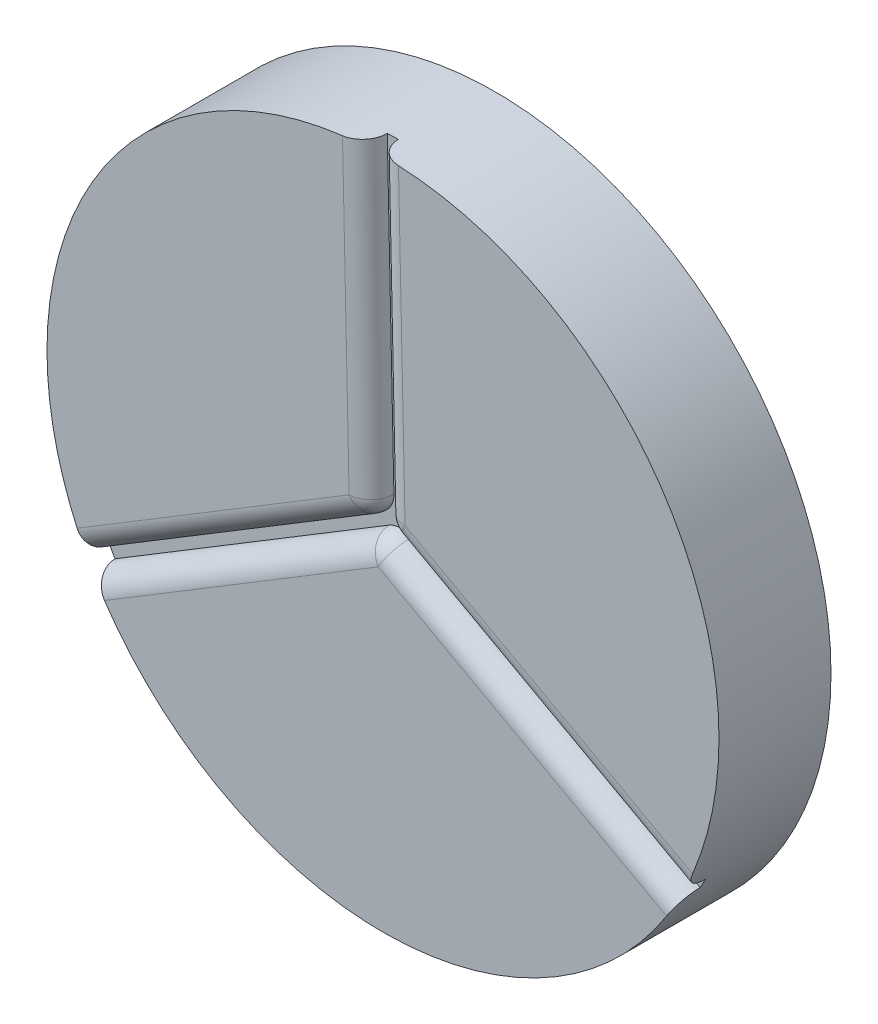
ISO-10303-21;
HEADER;
FILE_DESCRIPTION(('STEP AP214'),'2;1');
FILE_NAME('part.step','',(''),(''),'','','');
FILE_SCHEMA(('AUTOMOTIVE_DESIGN { 1 0 10303 214 1 1 1 1 }'));
ENDSEC;
DATA;
#1=APPLICATION_CONTEXT('core data for automotive mechanical design processes');
#2=APPLICATION_PROTOCOL_DEFINITION('international standard','automotive_design',2000,#1);
#3=PRODUCT_CONTEXT('',#1,'mechanical');
#4=PRODUCT('Part','Part','',(#3));
#5=PRODUCT_RELATED_PRODUCT_CATEGORY('part','',(#4));
#6=PRODUCT_DEFINITION_FORMATION('','',#4);
#7=PRODUCT_DEFINITION_CONTEXT('part definition',#1,'design');
#8=PRODUCT_DEFINITION('design','',#6,#7);
#9=PRODUCT_DEFINITION_SHAPE('','',#8);
#10=(LENGTH_UNIT() NAMED_UNIT(*) SI_UNIT(.MILLI.,.METRE.));
#11=(NAMED_UNIT(*) PLANE_ANGLE_UNIT() SI_UNIT($,.RADIAN.));
#12=(NAMED_UNIT(*) SI_UNIT($,.STERADIAN.) SOLID_ANGLE_UNIT());
#13=UNCERTAINTY_MEASURE_WITH_UNIT(LENGTH_MEASURE(1.E-05),#10,'distance_accuracy_value','');
#14=(GEOMETRIC_REPRESENTATION_CONTEXT(3) GLOBAL_UNCERTAINTY_ASSIGNED_CONTEXT((#13)) GLOBAL_UNIT_ASSIGNED_CONTEXT((#10,
#11,#12)) REPRESENTATION_CONTEXT('',''));
#15=CARTESIAN_POINT('',(0.,0.,0.));
#16=DIRECTION('',(0.,0.,1.));
#17=DIRECTION('',(1.,0.,0.));
#18=AXIS2_PLACEMENT_3D('',#15,#16,#17);
#19=CARTESIAN_POINT('',(0.0986919220805698,0.120916949838367,-0.100000000000118));
#20=DIRECTION('',(-0.740494050701913,-0.449075228525401,0.499999999999931));
#21=DIRECTION('',(-0.518547408150426,0.855048879012467,1.24938948076192E-12));
#22=AXIS2_PLACEMENT_3D('',#19,#20,#21);
#23=SPHERICAL_SURFACE('',#22,0.0999999999997225);
#24=CARTESIAN_POINT('',(0.0986919220811878,0.120916949838977,-0.1));
#25=DIRECTION('',(0.876599668029982,-0.48122034662899,0.));
#26=DIRECTION('',(0.48122034662899,0.876599668029982,0.));
#27=AXIS2_PLACEMENT_3D('',#24,#25,#26);
#28=CIRCLE('',#27,0.1);
#29=CARTESIAN_POINT('',(0.0986919220808351,0.120916949838754,0.));
#30=VERTEX_POINT('',#29);
#31=CARTESIAN_POINT('',(0.0505698874181295,0.0332569830359396,-0.1));
#32=VERTEX_POINT('',#31);
#33=EDGE_CURVE('E196',#30,#32,#28,.T.);
#34=ORIENTED_EDGE('',*,*,#33,.F.);
#35=CARTESIAN_POINT('',(0.098691922080996,0.120916949838389,-0.1));
#36=DIRECTION('',(0.0215507890165299,-0.999767754777461,0.));
#37=DIRECTION('',(0.999767754777461,0.0215507890165299,0.));
#38=AXIS2_PLACEMENT_3D('',#35,#36,#37);
#39=CIRCLE('',#38,0.1);
#40=CARTESIAN_POINT('',(-0.00128485339676502,0.118761870936874,-0.1));
#41=VERTEX_POINT('',#40);
#42=EDGE_CURVE('E211',#41,#30,#39,.F.);
#43=ORIENTED_EDGE('',*,*,#42,.F.);
#44=CARTESIAN_POINT('',(0.0986919220805907,0.120916949838392,-0.1));
#45=DIRECTION('',(0.,0.,-1.));
#46=DIRECTION('',(-1.,0.,0.));
#47=AXIS2_PLACEMENT_3D('',#44,#45,#46);
#48=CIRCLE('',#47,0.0999999999996428);
#49=EDGE_CURVE('E108',#41,#32,#48,.F.);
#50=ORIENTED_EDGE('',*,*,#49,.T.);
#51=EDGE_LOOP('',(#34,#43,#50));
#52=FACE_BOUND('',#51,.T.);
#53=ADVANCED_FACE('F17',(#52),#23,.T.);
#54=CARTESIAN_POINT('',(-0.151250016613774,0.1155292525847,-0.0999999999977621));
#55=DIRECTION('',(0.759157581463048,-0.416749044998445,0.500000000000061));
#56=DIRECTION('',(-0.48122034662878,-0.876599668030098,0.));
#57=AXIS2_PLACEMENT_3D('',#54,#55,#56);
#58=SPHERICAL_SURFACE('',#57,0.0999999999993052);
#59=CARTESIAN_POINT('',(-0.151250016613774,0.1155292525847,-0.1));
#60=DIRECTION('',(0.,0.,-1.));
#61=DIRECTION('',(-1.,0.,0.));
#62=AXIS2_PLACEMENT_3D('',#59,#60,#61);
#63=CIRCLE('',#62,0.0999999999993052);
#64=CARTESIAN_POINT('',(-0.0993952757988851,0.0300243646835175,-0.1));
#65=VERTEX_POINT('',#64);
#66=CARTESIAN_POINT('',(-0.0512732411361387,0.117684331486302,-0.1));
#67=VERTEX_POINT('',#66);
#68=EDGE_CURVE('E197',#65,#67,#63,.F.);
#69=ORIENTED_EDGE('',*,*,#68,.T.);
#70=CARTESIAN_POINT('',(-0.15125001661369,0.115529252584605,-0.1));
#71=DIRECTION('',(-0.0215507890165299,0.999767754777461,0.));
#72=DIRECTION('',(-0.999767754777461,-0.0215507890165299,0.));
#73=AXIS2_PLACEMENT_3D('',#70,#71,#72);
#74=CIRCLE('',#73,0.1);
#75=CARTESIAN_POINT('',(-0.15125001661289,0.115529252584002,0.));
#76=VERTEX_POINT('',#75);
#77=EDGE_CURVE('E114',#76,#67,#74,.T.);
#78=ORIENTED_EDGE('',*,*,#77,.F.);
#79=CARTESIAN_POINT('',(-0.151250016613328,0.115529252584909,-0.1));
#80=DIRECTION('',(0.855048879013511,0.518547408148704,0.));
#81=DIRECTION('',(-0.518547408148704,0.855048879013511,0.));
#82=AXIS2_PLACEMENT_3D('',#79,#80,#81);
#83=CIRCLE('',#82,0.1);
#84=EDGE_CURVE('E173',#65,#76,#83,.F.);
#85=ORIENTED_EDGE('',*,*,#84,.F.);
#86=EDGE_LOOP('',(#69,#78,#85));
#87=FACE_BOUND('',#86,.T.);
#88=ADVANCED_FACE('F266',(#87),#58,.T.);
#89=CARTESIAN_POINT('',(-0.0216131645762324,-0.0982329671689023,-0.0999999999999816));
#90=DIRECTION('',(-0.0186635307598088,0.865824273521791,0.50000000000004));
#91=DIRECTION('',(0.,0.500087104601494,-0.865975108078341));
#92=AXIS2_PLACEMENT_3D('',#89,#90,#91);
#93=SPHERICAL_SURFACE('',#92,0.0999999999999867);
#94=CARTESIAN_POINT('',(-0.0216131645762633,-0.098232967168913,-0.1));
#95=DIRECTION('',(-0.876599668029982,0.48122034662899,0.));
#96=DIRECTION('',(-0.48122034662899,-0.876599668029982,0.));
#97=AXIS2_PLACEMENT_3D('',#94,#95,#96);
#98=CIRCLE('',#97,0.1);
#99=CARTESIAN_POINT('',(0.0265088700866467,-0.0105730003659176,-0.1));
#100=VERTEX_POINT('',#99);
#101=CARTESIAN_POINT('',(-0.0216131645762401,-0.0982329671688944,0.));
#102=VERTEX_POINT('',#101);
#103=EDGE_CURVE('E257',#100,#102,#98,.F.);
#104=ORIENTED_EDGE('',*,*,#103,.F.);
#105=CARTESIAN_POINT('',(-0.0216131645762331,-0.0982329671674156,-0.1));
#106=DIRECTION('',(0.,0.,-1.));
#107=DIRECTION('',(-1.,0.,0.));
#108=AXIS2_PLACEMENT_3D('',#105,#106,#107);
#109=CIRCLE('',#108,0.0999999999985947);
#110=CARTESIAN_POINT('',(-0.0734679053907526,-0.0127280792673796,-0.1));
#111=VERTEX_POINT('',#110);
#112=EDGE_CURVE('E202',#100,#111,#109,.F.);
#113=ORIENTED_EDGE('',*,*,#112,.T.);
#114=CARTESIAN_POINT('',(-0.0216131645762258,-0.0982329671689006,-0.1));
#115=DIRECTION('',(-0.855048879013511,-0.518547408148704,0.));
#116=DIRECTION('',(0.518547408148704,-0.855048879013511,0.));
#117=AXIS2_PLACEMENT_3D('',#114,#115,#116);
#118=CIRCLE('',#117,0.1);
#119=CARTESIAN_POINT('',(-0.0225720660970541,-0.09665180475717,-1.70992954214957E-05));
#120=VERTEX_POINT('',#119);
#121=EDGE_CURVE('E222',#120,#111,#118,.T.);
#122=ORIENTED_EDGE('',*,*,#121,.F.);
#123=CARTESIAN_POINT('',(-0.0225720660970501,-0.0966518047571699,-1.70992954189703E-05));
#124=CARTESIAN_POINT('',(-0.0225324741709384,-0.096717801500373,-1.56758885321954E-05));
#125=CARTESIAN_POINT('',(-0.0224928414227235,-0.0967837756700154,-1.43413394966756E-05));
#126=CARTESIAN_POINT('',(-0.0224134829933346,-0.0969156983323176,-1.18495925877549E-05));
#127=CARTESIAN_POINT('',(-0.0223737572879055,-0.0969816468113912,-1.06924478911297E-05));
#128=CARTESIAN_POINT('',(-0.0222942134813897,-0.0971135177426185,-8.55567812112103E-06));
#129=CARTESIAN_POINT('',(-0.0222543953562738,-0.0971794401811376,-7.57610611159042E-06));
#130=CARTESIAN_POINT('',(-0.0221746672486567,-0.0973112586823505,-5.79464816130326E-06));
#131=CARTESIAN_POINT('',(-0.0221347572423515,-0.0973771547313625,-4.9928151701558E-06));
#132=CARTESIAN_POINT('',(-0.022054845911714,-0.0975089201052404,-3.56700010873206E-06));
#133=CARTESIAN_POINT('',(-0.0220148445638028,-0.0975747894163782,-2.94307087263232E-06));
#134=CARTESIAN_POINT('',(-0.0219347510903505,-0.0977065009669237,-1.87322643622823E-06));
#135=CARTESIAN_POINT('',(-0.021894658941455,-0.097772343192558,-1.42736395344255E-06));
#136=CARTESIAN_POINT('',(-0.0218143844075068,-0.0979040002251036,-7.1381453841295E-07));
#137=CARTESIAN_POINT('',(-0.0217742019993238,-0.097969815018197,-4.4618020585125E-07));
#138=CARTESIAN_POINT('',(-0.0216937474892144,-0.0981014168397046,-8.92465855037926E-08));
#139=CARTESIAN_POINT('',(-0.0216534753643812,-0.0981672038542571,2.21732446451596E-13));
#140=CARTESIAN_POINT('',(-0.02161316457623,-0.0982329671689,0.));
#141=B_SPLINE_CURVE_WITH_KNOTS('',3,(#123,#124,#125,#126,#127,#128,#129,#130,#131,#132,#133,
#134,#135,#136,#137,#138,#139,#140),.UNSPECIFIED.,.F.,.F.,(4,2,2,2,2,2,2,2,4),(0.,
0.00023092427501441,0.000461917634585058,0.000692979908267161,0.000924110924667625,
0.00115531051144815,0.00138657849532839,0.00161791470208916,0.00184931895657562),.UNSPECIFIED.);
#142=EDGE_CURVE('E123',#102,#120,#141,.F.);
#143=ORIENTED_EDGE('',*,*,#142,.F.);
#144=EDGE_LOOP('',(#104,#113,#122,#143));
#145=FACE_BOUND('',#144,.T.);
#146=ADVANCED_FACE('F19',(#145),#93,.T.);
#147=CARTESIAN_POINT('',(-0.02472375303622,0.04607107841807,-0.1));
#148=DIRECTION('',(0.,0.,-1.));
#149=DIRECTION('',(-1.,0.,0.));
#150=AXIS2_PLACEMENT_3D('',#147,#148,#149);
#151=PLANE('',#150);
#152=ORIENTED_EDGE('',*,*,#68,.F.);
#153=DIRECTION('',(0.855048879013511,0.518547408148704,0.));
#154=VECTOR('',#153,1.);
#155=CARTESIAN_POINT('',(-0.90008280219013,-0.455555409453351,-0.1));
#156=LINE('',#155,#154);
#157=CARTESIAN_POINT('',(-1.32091178801661,-0.710768632030678,-0.1));
#158=VERTEX_POINT('',#157);
#159=EDGE_CURVE('E172',#158,#65,#156,.T.);
#160=ORIENTED_EDGE('',*,*,#159,.F.);
#161=CARTESIAN_POINT('',(0.,0.,-0.1));
#162=DIRECTION('',(0.,0.,-1.));
#163=DIRECTION('',(-1.,0.,0.));
#164=AXIS2_PLACEMENT_3D('',#161,#162,#163);
#165=CIRCLE('',#164,1.5);
#166=CARTESIAN_POINT('',(-1.29647369610963,-0.754424254180526,-0.1));
#167=VERTEX_POINT('',#166);
#168=EDGE_CURVE('E199',#167,#158,#165,.T.);
#169=ORIENTED_EDGE('',*,*,#168,.F.);
#170=DIRECTION('',(-0.855048879013511,-0.518547408148704,0.));
#171=VECTOR('',#170,1.);
#172=CARTESIAN_POINT('',(-0.0191065527689004,0.0202395547444611,-0.1));
#173=LINE('',#172,#171);
#174=EDGE_CURVE('E256',#111,#167,#173,.T.);
#175=ORIENTED_EDGE('',*,*,#174,.F.);
#176=ORIENTED_EDGE('',*,*,#112,.F.);
#177=DIRECTION('',(-0.876599668029982,0.48122034662899,0.));
#178=VECTOR('',#177,1.);
#179=CARTESIAN_POINT('',(0.865388175406899,-0.471086282322002,-0.1));
#180=LINE('',#179,#178);
#181=CARTESIAN_POINT('',(1.31657459654194,-0.718770708738497,-0.1));
#182=VERTEX_POINT('',#181);
#183=EDGE_CURVE('E253',#182,#100,#180,.T.);
#184=ORIENTED_EDGE('',*,*,#183,.F.);
#185=CARTESIAN_POINT('',(0.,0.,-0.1));
#186=DIRECTION('',(0.,0.,-1.));
#187=DIRECTION('',(-1.,0.,0.));
#188=AXIS2_PLACEMENT_3D('',#185,#186,#187);
#189=CIRCLE('',#188,1.5);
#190=CARTESIAN_POINT('',(1.33980291959213,-0.674483607400816,-0.1));
#191=VERTEX_POINT('',#190);
#192=EDGE_CURVE('E205',#191,#182,#189,.T.);
#193=ORIENTED_EDGE('',*,*,#192,.F.);
#194=DIRECTION('',(0.876599668029982,-0.48122034662899,0.));
#195=VECTOR('',#194,1.);
#196=CARTESIAN_POINT('',(0.012849524708351,0.0539640477090018,-0.1));
#197=LINE('',#196,#195);
#198=EDGE_CURVE('E213',#32,#191,#197,.T.);
#199=ORIENTED_EDGE('',*,*,#198,.F.);
#200=ORIENTED_EDGE('',*,*,#49,.F.);
#201=DIRECTION('',(0.0215507890165299,-0.999767754777461,0.));
#202=VECTOR('',#201,1.);
#203=CARTESIAN_POINT('',(-0.0209338175486061,1.03030161821635,-0.1));
#204=LINE('',#203,#202);
#205=CARTESIAN_POINT('',(-0.0310516109009531,1.49967856471327,-0.1));
#206=VERTEX_POINT('',#205);
#207=EDGE_CURVE('E105',#206,#41,#204,.T.);
#208=ORIENTED_EDGE('',*,*,#207,.F.);
#209=CARTESIAN_POINT('',(0.,0.,-0.1));
#210=DIRECTION('',(0.,0.,-1.));
#211=DIRECTION('',(-1.,0.,0.));
#212=AXIS2_PLACEMENT_3D('',#209,#210,#211);
#213=CIRCLE('',#212,1.5);
#214=CARTESIAN_POINT('',(-0.0810229509537888,1.49781016200944,-0.1));
#215=VERTEX_POINT('',#214);
#216=EDGE_CURVE('E22',#215,#206,#213,.T.);
#217=ORIENTED_EDGE('',*,*,#216,.F.);
#218=DIRECTION('',(-0.0215507890165299,0.999767754777461,0.));
#219=VECTOR('',#218,1.);
#220=CARTESIAN_POINT('',(-0.0493714162712539,0.029456323987683,-0.1));
#221=LINE('',#220,#219);
#222=EDGE_CURVE('E102',#67,#215,#221,.T.);
#223=ORIENTED_EDGE('',*,*,#222,.F.);
#224=EDGE_LOOP('',(#152,#160,#169,#175,#176,#184,#193,#199,#200,#208,#217,#223));
#225=FACE_BOUND('',#224,.T.);
#226=ADVANCED_FACE('F101',(#225),#151,.F.);
#227=CARTESIAN_POINT('',(0.06097155937125,0.141624014512,-0.1));
#228=DIRECTION('',(0.876599668029982,-0.48122034662899,0.));
#229=DIRECTION('',(0.48122034662899,0.876599668029982,0.));
#230=AXIS2_PLACEMENT_3D('',#227,#228,#229);
#231=CYLINDRICAL_SURFACE('',#230,0.1);
#232=ORIENTED_EDGE('',*,*,#33,.T.);
#233=ORIENTED_EDGE('',*,*,#198,.T.);
#234=CARTESIAN_POINT('',(1.33980291959213,-0.674483607400816,-0.1));
#235=CARTESIAN_POINT('',(1.33979997243639,-0.674487460745058,-0.0943784717365968));
#236=CARTESIAN_POINT('',(1.34001606087463,-0.674060188244451,-0.0887583527153043));
#237=CARTESIAN_POINT('',(1.34086456668507,-0.672371787047792,-0.0776813121184586));
#238=CARTESIAN_POINT('',(1.34149666153556,-0.671111304320142,-0.0722242675379891));
#239=CARTESIAN_POINT('',(1.34315590377756,-0.667783987830423,-0.061621984643874));
#240=CARTESIAN_POINT('',(1.34418324339017,-0.665716761714276,-0.0564768994583958));
#241=CARTESIAN_POINT('',(1.34659194837936,-0.660830963757906,-0.0466482222094613));
#242=CARTESIAN_POINT('',(1.34797325040688,-0.658012526359216,-0.0419645477742341));
#243=CARTESIAN_POINT('',(1.35103725758049,-0.651698234762365,-0.0331916551874666));
#244=CARTESIAN_POINT('',(1.35271989436155,-0.648202534202931,-0.0291023025801678));
#245=CARTESIAN_POINT('',(1.35632472459432,-0.640625325713237,-0.0216317899365167));
#246=CARTESIAN_POINT('',(1.35824695899009,-0.636543717640998,-0.0182507512070127));
#247=CARTESIAN_POINT('',(1.3622621507965,-0.627904851324816,-0.0122921188903216));
#248=CARTESIAN_POINT('',(1.36435514343875,-0.623347494867833,-0.00971469163947759));
#249=CARTESIAN_POINT('',(1.36863983349846,-0.613882660031763,-0.00543606318761826));
#250=CARTESIAN_POINT('',(1.3708314803331,-0.608975360341237,-0.00373441838951092));
#251=CARTESIAN_POINT('',(1.37450844348102,-0.600616298881465,-0.00166386306928844));
#252=CARTESIAN_POINT('',(1.37598665522126,-0.597222283114772,-0.00104003759877238));
#253=CARTESIAN_POINT('',(1.37893388648669,-0.590385736598235,-0.000208154831414105));
#254=CARTESIAN_POINT('',(1.38040291633461,-0.58694328455315,5.12675939404059E-07));
#255=CARTESIAN_POINT('',(1.38185925080286,-0.583493796857051,4.46234541853003E-13));
#256=B_SPLINE_CURVE_WITH_KNOTS('',3,(#234,#235,#236,#237,#238,#239,#240,#241,#242,#243,#244,
#245,#246,#247,#248,#249,#250,#251,#252,#253,#254,#255),.UNSPECIFIED.,.F.,.F.,(4,2,2,2,2,2,2,2,
2,2,4),(0.,0.0168422146447174,0.033671387204561,0.0505087547368597,0.0673431109681186,
0.0841736527485485,0.101007074599536,0.117843978423987,0.134672345687463,0.145912926073788,
0.157136972506302),.UNSPECIFIED.);
#257=CARTESIAN_POINT('',(1.38185925080287,-0.583493796856938,0.));
#258=VERTEX_POINT('',#257);
#259=EDGE_CURVE('E189',#191,#258,#256,.T.);
#260=ORIENTED_EDGE('',*,*,#259,.T.);
#261=DIRECTION('',(0.87659966803003,-0.481220346628903,0.));
#262=VECTOR('',#261,1.);
#263=CARTESIAN_POINT('',(0.09869192208097,0.120916949839,0.));
#264=LINE('',#263,#262);
#265=EDGE_CURVE('E250',#30,#258,#264,.T.);
#266=ORIENTED_EDGE('',*,*,#265,.F.);
#267=EDGE_LOOP('',(#232,#233,#260,#266));
#268=FACE_BOUND('',#267,.T.);
#269=ADVANCED_FACE('F182',(#268),#231,.T.);
#270=CARTESIAN_POINT('',(0.07904295792914,1.032456697118,-0.1));
#271=DIRECTION('',(0.0215507890165299,-0.999767754777461,0.));
#272=DIRECTION('',(0.999767754777461,0.0215507890165299,0.));
#273=AXIS2_PLACEMENT_3D('',#270,#271,#272);
#274=CYLINDRICAL_SURFACE('',#273,0.1);
#275=CARTESIAN_POINT('',(0.0689989163102293,1.49841220948977,0.));
#276=CARTESIAN_POINT('',(0.0633800241231705,1.49867216851715,4.85949943362656E-06));
#277=CARTESIAN_POINT('',(0.0577607194685888,1.49889806753507,-0.000472141441023828));
#278=CARTESIAN_POINT('',(0.0466821339457714,1.49928332990871,-0.00235649157608473));
#279=CARTESIAN_POINT('',(0.0412227365574897,1.49944274289198,-0.00376314481039502));
#280=CARTESIAN_POINT('',(0.0306130114831193,1.49969707139335,-0.00747454313935292));
#281=CARTESIAN_POINT('',(0.0254628562806125,1.49979195121641,-0.00977978415985603));
#282=CARTESIAN_POINT('',(0.0156229594903334,1.49992669491592,-0.0152216283520424));
#283=CARTESIAN_POINT('',(0.0109331261694832,1.49996656977453,-0.0183580654199059));
#284=CARTESIAN_POINT('',(0.00215201119712001,1.50000489326798,-0.0253697354319191));
#285=CARTESIAN_POINT('',(-0.00193999270785334,1.50000339231312,-0.0292440636472177));
#286=CARTESIAN_POINT('',(-0.00941690786773728,1.49997511108121,-0.0376251036160328));
#287=CARTESIAN_POINT('',(-0.0128016744175206,1.49994832563698,-0.0421319444708188));
#288=CARTESIAN_POINT('',(-0.0187691375664675,1.49988555041045,-0.0516521677451726));
#289=CARTESIAN_POINT('',(-0.0213512968600728,1.49984955449147,-0.0566658865311816));
#290=CARTESIAN_POINT('',(-0.0256365325691746,1.4997824470016,-0.0670545340283511));
#291=CARTESIAN_POINT('',(-0.0273401143811476,1.49975133262983,-0.0724292530604493));
#292=CARTESIAN_POINT('',(-0.0294018344414191,1.49971204080503,-0.0815300210762116));
#293=CARTESIAN_POINT('',(-0.0300201134240228,1.49969966525653,-0.0851992418659845));
#294=CARTESIAN_POINT('',(-0.0308449578621895,1.49968284522492,-0.0925784654193207));
#295=CARTESIAN_POINT('',(-0.0310520995193386,1.49967838964304,-0.0962884037700907));
#296=CARTESIAN_POINT('',(-0.0310516109014883,1.49967856471393,-0.0999999999998816));
#297=B_SPLINE_CURVE_WITH_KNOTS('',3,(#275,#276,#277,#278,#279,#280,#281,#282,#283,#284,#285,
#286,#287,#288,#289,#290,#291,#292,#293,#294,#295,#296),.UNSPECIFIED.,.F.,.F.,(4,2,2,2,2,2,2,2,
2,2,4),(0.,0.0168527569326192,0.0336929117514092,0.0505423737515698,0.0673884711395954,
0.0842140449596053,0.101043058032029,0.117883313145309,0.134713870166185,0.145855281119522,
0.156981066528714),.UNSPECIFIED.);
#298=CARTESIAN_POINT('',(0.0689989163102371,1.49841220948977,0.));
#299=VERTEX_POINT('',#298);
#300=EDGE_CURVE('E152',#299,#206,#297,.T.);
#301=ORIENTED_EDGE('',*,*,#300,.T.);
#302=ORIENTED_EDGE('',*,*,#207,.T.);
#303=ORIENTED_EDGE('',*,*,#42,.T.);
#304=DIRECTION('',(0.0215507890165213,-0.999767754777461,0.));
#305=VECTOR('',#304,1.);
#306=CARTESIAN_POINT('',(0.06899891631024,1.49841220949,0.));
#307=LINE('',#306,#305);
#308=EDGE_CURVE('E247',#299,#30,#307,.T.);
#309=ORIENTED_EDGE('',*,*,#308,.F.);
#310=EDGE_LOOP('',(#301,#302,#303,#309));
#311=FACE_BOUND('',#310,.T.);
#312=ADVANCED_FACE('F177',(#311),#274,.T.);
#313=CARTESIAN_POINT('',(-0.951937543005,-0.370050521552,-0.1));
#314=DIRECTION('',(0.855048879013511,0.518547408148704,0.));
#315=DIRECTION('',(-0.518547408148704,0.855048879013511,0.));
#316=AXIS2_PLACEMENT_3D('',#313,#314,#315);
#317=CYLINDRICAL_SURFACE('',#316,0.1);
#318=ORIENTED_EDGE('',*,*,#84,.T.);
#319=DIRECTION('',(0.855048879013931,0.518547408148011,0.));
#320=VECTOR('',#319,1.);
#321=CARTESIAN_POINT('',(-1.36548462118,-0.620847605553,0.));
#322=LINE('',#321,#320);
#323=CARTESIAN_POINT('',(-1.36548462117996,-0.620847605553096,0.));
#324=VERTEX_POINT('',#323);
#325=EDGE_CURVE('E244',#324,#76,#322,.T.);
#326=ORIENTED_EDGE('',*,*,#325,.F.);
#327=CARTESIAN_POINT('',(-1.36548462118001,-0.620847605553003,0.));
#328=CARTESIAN_POINT('',(-1.36314372206303,-0.625999135873543,4.84235588072246E-06));
#329=CARTESIAN_POINT('',(-1.36077176534732,-0.631135729427582,-0.000473288346804834));
#330=CARTESIAN_POINT('',(-1.35604055575402,-0.641236391130032,-0.00236442147393956));
#331=CARTESIAN_POINT('',(-1.35368129648049,-0.646200554707325,-0.00377689783355714));
#332=CARTESIAN_POINT('',(-1.34904595795603,-0.655823019782317,-0.00750695372713122));
#333=CARTESIAN_POINT('',(-1.34676993517759,-0.660481115272148,-0.00982513572765936));
#334=CARTESIAN_POINT('',(-1.34238021959705,-0.669357764179386,-0.0153010630252555));
#335=CARTESIAN_POINT('',(-1.34026648338968,-0.673576435233941,-0.0184585828172698));
#336=CARTESIAN_POINT('',(-1.33628442469241,-0.681442102023292,-0.0255089847798545));
#337=CARTESIAN_POINT('',(-1.33441503511355,-0.685091597907119,-0.0293984752157205));
#338=CARTESIAN_POINT('',(-1.33097818704456,-0.691744983278812,-0.0378130545092073));
#339=CARTESIAN_POINT('',(-1.32941079099286,-0.694748739272096,-0.0423382744728537));
#340=CARTESIAN_POINT('',(-1.32664066020702,-0.700023890391155,-0.0518821600346066));
#341=CARTESIAN_POINT('',(-1.32543702723187,-0.702297090376108,-0.0568995689651646));
#342=CARTESIAN_POINT('',(-1.32343539025936,-0.706061854050908,-0.0672940820772782));
#343=CARTESIAN_POINT('',(-1.32263714281917,-0.707553886865354,-0.0726709681841128));
#344=CARTESIAN_POINT('',(-1.32167680794507,-0.709345514408751,-0.0817342821698405));
#345=CARTESIAN_POINT('',(-1.32139023864639,-0.709878945550082,-0.0853635058311387));
#346=CARTESIAN_POINT('',(-1.3210076871138,-0.710590414549813,-0.0926613111465448));
#347=CARTESIAN_POINT('',(-1.32091143385718,-0.710768957794108,-0.0963298293411923));
#348=CARTESIAN_POINT('',(-1.32091178801695,-0.710768632031492,-0.0999999999998752));
#349=B_SPLINE_CURVE_WITH_KNOTS('',3,(#327,#328,#329,#330,#331,#332,#333,#334,#335,#336,#337,
#338,#339,#340,#341,#342,#343,#344,#345,#346,#347,#348),.UNSPECIFIED.,.F.,.F.,(4,2,2,2,2,2,2,2,
2,2,4),(0.,0.0169540472271688,0.0338985569290777,0.050854357196853,0.0678056065426309,
0.0846801610764588,0.10155820075963,0.11839421637767,0.135220109610608,0.146237502239674,
0.157239194036116),.UNSPECIFIED.);
#350=EDGE_CURVE('E168',#324,#158,#349,.T.);
#351=ORIENTED_EDGE('',*,*,#350,.T.);
#352=ORIENTED_EDGE('',*,*,#159,.T.);
#353=EDGE_LOOP('',(#318,#326,#351,#352));
#354=FACE_BOUND('',#353,.T.);
#355=ADVANCED_FACE('F174',(#354),#317,.T.);
#356=CARTESIAN_POINT('',(-0.149348191749,0.02730124508603,-0.1));
#357=DIRECTION('',(-0.0215507890165299,0.999767754777461,0.));
#358=DIRECTION('',(-0.999767754777461,-0.0215507890165299,0.));
#359=AXIS2_PLACEMENT_3D('',#356,#357,#358);
#360=CYLINDRICAL_SURFACE('',#359,0.1);
#361=CARTESIAN_POINT('',(-0.0810229509537888,1.49781016200944,-0.1));
#362=CARTESIAN_POINT('',(-0.081018142539037,1.49780952089804,-0.0943779003171716));
#363=CARTESIAN_POINT('',(-0.0814963422978624,1.49778453957795,-0.0887572095335437));
#364=CARTESIAN_POINT('',(-0.0833833120601546,1.49768115091021,-0.0776790328657951));
#365=CARTESIAN_POINT('',(-0.0847913623908804,1.49760278487905,-0.0722214241734881));
#366=CARTESIAN_POINT('',(-0.0885035914798177,1.49738784261015,-0.0616180422409898));
#367=CARTESIAN_POINT('',(-0.0908082063987046,1.49725123803742,-0.0564724221874231));
#368=CARTESIAN_POINT('',(-0.0962454496065726,1.49691157155933,-0.0466427298842348));
#369=CARTESIAN_POINT('',(-0.0993779296448824,1.49670852155118,-0.0419585752032615));
#370=CARTESIAN_POINT('',(-0.10638054348136,1.49622706926309,-0.0331849109486429));
#371=CARTESIAN_POINT('',(-0.110250495144657,1.49594868558133,-0.0290952549891436));
#372=CARTESIAN_POINT('',(-0.118617890296329,1.49530845183355,-0.0216242884225663));
#373=CARTESIAN_POINT('',(-0.123115441308967,1.49494658745814,-0.0182430994433443));
#374=CARTESIAN_POINT('',(-0.132607669672416,1.49413449048308,-0.0122848058975284));
#375=CARTESIAN_POINT('',(-0.137602390494806,1.49368425015266,-0.00970777172630223));
#376=CARTESIAN_POINT('',(-0.147944680922077,1.49269530880553,-0.00543017054770977));
#377=CARTESIAN_POINT('',(-0.153292068533026,1.49215665320519,-0.00372915540119659));
#378=CARTESIAN_POINT('',(-0.162368562318219,1.49119073862745,-0.00166091971993404));
#379=CARTESIAN_POINT('',(-0.166043953582978,1.49078606923516,-0.00103820714867508));
#380=CARTESIAN_POINT('',(-0.173432170800563,1.48994470703221,-0.000207795993530109));
#381=CARTESIAN_POINT('',(-0.177144933876638,1.48950806210541,5.10506682118134E-07));
#382=CARTESIAN_POINT('',(-0.180857498171845,1.48905693825156,4.44853812181324E-13));
#383=B_SPLINE_CURVE_WITH_KNOTS('',3,(#361,#362,#363,#364,#365,#366,#367,#368,#369,#370,#371,
#372,#373,#374,#375,#376,#377,#378,#379,#380,#381,#382),.UNSPECIFIED.,.F.,.F.,(4,2,2,2,2,2,2,2,
2,2,4),(0.,0.0168439277620262,0.0336748341513777,0.0505139386984399,0.0673500298089607,
0.0841819682520029,0.101016793997201,0.117853093042684,0.134680770679331,0.145907984231105,
0.157118715750987),.UNSPECIFIED.);
#384=CARTESIAN_POINT('',(-0.180857498171965,1.48905693825152,0.));
#385=VERTEX_POINT('',#384);
#386=EDGE_CURVE('E112',#215,#385,#383,.T.);
#387=ORIENTED_EDGE('',*,*,#386,.T.);
#388=DIRECTION('',(-0.0215507890170123,0.99976775477745,0.));
#389=VECTOR('',#388,1.);
#390=CARTESIAN_POINT('',(-0.151250016613,0.115529252584,0.));
#391=LINE('',#390,#389);
#392=EDGE_CURVE('E240',#76,#385,#391,.T.);
#393=ORIENTED_EDGE('',*,*,#392,.F.);
#394=ORIENTED_EDGE('',*,*,#77,.T.);
#395=ORIENTED_EDGE('',*,*,#222,.T.);
#396=EDGE_LOOP('',(#387,#393,#394,#395));
#397=FACE_BOUND('',#396,.T.);
#398=ADVANCED_FACE('F110',(#397),#360,.T.);
#399=CARTESIAN_POINT('',(0.03274818804597,-0.06526533315689,-0.1));
#400=DIRECTION('',(-0.855048879013511,-0.518547408148704,0.));
#401=DIRECTION('',(0.518547408148704,-0.855048879013511,0.));
#402=AXIS2_PLACEMENT_3D('',#399,#400,#401);
#403=CYLINDRICAL_SURFACE('',#402,0.1);
#404=ORIENTED_EDGE('',*,*,#121,.T.);
#405=ORIENTED_EDGE('',*,*,#174,.T.);
#406=CARTESIAN_POINT('',(-1.29647369610963,-0.754424254180526,-0.1));
#407=CARTESIAN_POINT('',(-1.29647532896089,-0.75441965672155,-0.0943743470848457));
#408=CARTESIAN_POINT('',(-1.29623502839045,-0.754834374383246,-0.0887501432853677));
#409=CARTESIAN_POINT('',(-1.29528260973294,-0.756468485587479,-0.0776651986069069));
#410=CARTESIAN_POINT('',(-1.29457086518821,-0.7576872420575,-0.0722043318873682));
#411=CARTESIAN_POINT('',(-1.29268712506439,-0.760896338672836,-0.0615947034977518));
#412=CARTESIAN_POINT('',(-1.29151491057574,-0.762887045801297,-0.0564460916209905));
#413=CARTESIAN_POINT('',(-1.28873400394102,-0.767575478970324,-0.0466104877772194));
#414=CARTESIAN_POINT('',(-1.28712538588933,-0.770273084988075,-0.041923417631733));
#415=CARTESIAN_POINT('',(-1.28350435921823,-0.776291725669586,-0.0331428205942872));
#416=CARTESIAN_POINT('',(-1.2814919359195,-0.779612782997084,-0.0290493152892208));
#417=CARTESIAN_POINT('',(-1.27710635060507,-0.786776315593557,-0.0215716346423124));
#418=CARTESIAN_POINT('',(-1.27473312344645,-0.790618885007758,-0.0181875876557564));
#419=CARTESIAN_POINT('',(-1.26968237580014,-0.798704797325091,-0.0122277022730997));
#420=CARTESIAN_POINT('',(-1.26700501951653,-0.802947923754081,-0.00965143054538935));
#421=CARTESIAN_POINT('',(-1.26141047285302,-0.811708416808021,-0.0053785158098907));
#422=CARTESIAN_POINT('',(-1.2584934209504,-0.816225624701095,-0.00368136899532854));
#423=CARTESIAN_POINT('',(-1.25352002755282,-0.823832876965456,-0.0016336642586827));
#424=CARTESIAN_POINT('',(-1.25150909842914,-0.826884733360817,-0.00102131302724594));
#425=CARTESIAN_POINT('',(-1.24744264614483,-0.833006882961097,-0.000204525383245972));
#426=CARTESIAN_POINT('',(-1.24538719045898,-0.836077143780036,4.89811929949148E-07));
#427=CARTESIAN_POINT('',(-1.24331917584499,-0.839140886249872,4.51339621213428E-13));
#428=B_SPLINE_CURVE_WITH_KNOTS('',3,(#406,#407,#408,#409,#410,#411,#412,#413,#414,#415,#416,
#417,#418,#419,#420,#421,#422,#423,#424,#425,#426,#427),.UNSPECIFIED.,.F.,.F.,(4,2,2,2,2,2,2,2,
2,2,4),(0.,0.0168544972533863,0.0336956560192413,0.0505448308588221,0.0673911467653819,
0.0842380751887784,0.101088048935248,0.117928967974492,0.134760225153537,0.145856247791942,
0.156936492815913),.UNSPECIFIED.);
#429=CARTESIAN_POINT('',(-1.24331917584491,-0.839140886249942,0.));
#430=VERTEX_POINT('',#429);
#431=EDGE_CURVE('E37',#167,#430,#428,.T.);
#432=ORIENTED_EDGE('',*,*,#431,.T.);
#433=DIRECTION('',(-0.855048879013723,-0.518547408148354,0.));
#434=VECTOR('',#433,1.);
#435=CARTESIAN_POINT('',(-0.02161316457623,-0.0982329671689,0.));
#436=LINE('',#435,#434);
#437=EDGE_CURVE('E235',#102,#430,#436,.T.);
#438=ORIENTED_EDGE('',*,*,#437,.F.);
#439=ORIENTED_EDGE('',*,*,#142,.T.);
#440=EDGE_LOOP('',(#404,#405,#432,#438,#439));
#441=FACE_BOUND('',#440,.T.);
#442=ADVANCED_FACE('F310',(#441),#403,.T.);
#443=CARTESIAN_POINT('',(0.817266140744,-0.558746249125,-0.1));
#444=DIRECTION('',(-0.876599668029982,0.48122034662899,0.));
#445=DIRECTION('',(-0.48122034662899,-0.876599668029982,0.));
#446=AXIS2_PLACEMENT_3D('',#443,#444,#445);
#447=CYLINDRICAL_SURFACE('',#446,0.1);
#448=CARTESIAN_POINT('',(1.26573159762582,-0.804936968197883,0.));
#449=CARTESIAN_POINT('',(1.26875041252267,-0.800192271088087,4.85898108418834E-06));
#450=CARTESIAN_POINT('',(1.27173988247621,-0.795430307579139,-0.000472128666117678));
#451=CARTESIAN_POINT('',(1.27758152558921,-0.786012185843694,-0.00235629806544254));
#452=CARTESIAN_POINT('',(1.28043380094599,-0.781355950268711,-0.00376277555039496));
#453=CARTESIAN_POINT('',(1.28592874940946,-0.772279547670621,-0.00747353145134599));
#454=CARTESIAN_POINT('',(1.28857130712632,-0.767859511038686,-0.00977830005485939));
#455=CARTESIAN_POINT('',(1.29357987739315,-0.759391372246515,-0.0152188500799178));
#456=CARTESIAN_POINT('',(1.29594594407928,-0.755343197310144,-0.0183544684292922));
#457=CARTESIAN_POINT('',(1.30034504948473,-0.747744649969465,-0.0253647407595529));
#458=CARTESIAN_POINT('',(1.30237843570369,-0.744193758695979,-0.0292386143212898));
#459=CARTESIAN_POINT('',(1.30607175888462,-0.737692735733006,-0.0376186550422242));
#460=CARTESIAN_POINT('',(1.30773161953362,-0.734742726818185,-0.0421249511034437));
#461=CARTESIAN_POINT('',(1.31064479331496,-0.729533531508448,-0.0516446086332421));
#462=CARTESIAN_POINT('',(1.31189778595901,-0.72727488978059,-0.0566583657692111));
#463=CARTESIAN_POINT('',(1.31397087097294,-0.723522751876847,-0.0670471789599811));
#464=CARTESIAN_POINT('',(1.3147912120714,-0.722028816091058,-0.0724220254186568));
#465=CARTESIAN_POINT('',(1.31578277902849,-0.720219655759575,-0.0815240803717698));
#466=CARTESIAN_POINT('',(1.31607967181522,-0.719676726746895,-0.0851944604230526));
#467=CARTESIAN_POINT('',(1.31647548799118,-0.718952249627134,-0.0925760503904501));
#468=CARTESIAN_POINT('',(1.316574688177,-0.718770196246895,-0.0962871958934246));
#469=CARTESIAN_POINT('',(1.31657459654277,-0.718770708738364,-0.0999999999998825));
#470=B_SPLINE_CURVE_WITH_KNOTS('',3,(#448,#449,#450,#451,#452,#453,#454,#455,#456,#457,#458,
#459,#460,#461,#462,#463,#464,#465,#466,#467,#468,#469),.UNSPECIFIED.,.F.,.F.,(4,2,2,2,2,2,2,2,
2,2,4),(0.,0.0168489501176185,0.0336851485320722,0.0505305471656872,0.0673726419726399,
0.084197030563227,0.101024853338879,0.117865899348607,0.134697252967492,0.145842270691719,
0.156971672878128),.UNSPECIFIED.);
#471=CARTESIAN_POINT('',(1.26573159762581,-0.804936968197889,0.));
#472=VERTEX_POINT('',#471);
#473=EDGE_CURVE('E161',#472,#182,#470,.T.);
#474=ORIENTED_EDGE('',*,*,#473,.T.);
#475=ORIENTED_EDGE('',*,*,#183,.T.);
#476=ORIENTED_EDGE('',*,*,#103,.T.);
#477=DIRECTION('',(-0.876599668030114,0.48122034662875,0.));
#478=VECTOR('',#477,1.);
#479=CARTESIAN_POINT('',(1.265731597626,-0.804936968198,0.));
#480=LINE('',#479,#478);
#481=EDGE_CURVE('E232',#472,#102,#480,.T.);
#482=ORIENTED_EDGE('',*,*,#481,.F.);
#483=EDGE_LOOP('',(#474,#475,#476,#482));
#484=FACE_BOUND('',#483,.T.);
#485=ADVANCED_FACE('F302',(#484),#447,.T.);
#486=CARTESIAN_POINT('',(0.,0.,0.));
#487=DIRECTION('',(0.,0.,1.));
#488=DIRECTION('',(1.,0.,0.));
#489=AXIS2_PLACEMENT_3D('',#486,#487,#488);
#490=PLANE('',#489);
#491=CARTESIAN_POINT('',(0.,0.,0.));
#492=DIRECTION('',(0.,0.,-1.));
#493=DIRECTION('',(-1.,0.,0.));
#494=AXIS2_PLACEMENT_3D('',#491,#492,#493);
#495=CIRCLE('',#494,1.5);
#496=EDGE_CURVE('E231',#299,#258,#495,.T.);
#497=ORIENTED_EDGE('',*,*,#496,.F.);
#498=ORIENTED_EDGE('',*,*,#308,.T.);
#499=ORIENTED_EDGE('',*,*,#265,.T.);
#500=EDGE_LOOP('',(#497,#498,#499));
#501=FACE_BOUND('',#500,.T.);
#502=ADVANCED_FACE('F296',(#501),#490,.T.);
#503=CARTESIAN_POINT('',(0.,0.,0.));
#504=DIRECTION('',(0.,0.,1.));
#505=DIRECTION('',(1.,0.,0.));
#506=AXIS2_PLACEMENT_3D('',#503,#504,#505);
#507=PLANE('',#506);
#508=ORIENTED_EDGE('',*,*,#392,.T.);
#509=CARTESIAN_POINT('',(0.,0.,0.));
#510=DIRECTION('',(0.,0.,-1.));
#511=DIRECTION('',(-1.,0.,0.));
#512=AXIS2_PLACEMENT_3D('',#509,#510,#511);
#513=CIRCLE('',#512,1.5);
#514=EDGE_CURVE('E121',#324,#385,#513,.T.);
#515=ORIENTED_EDGE('',*,*,#514,.F.);
#516=ORIENTED_EDGE('',*,*,#325,.T.);
#517=EDGE_LOOP('',(#508,#515,#516));
#518=FACE_BOUND('',#517,.T.);
#519=ADVANCED_FACE('F264',(#518),#507,.T.);
#520=CARTESIAN_POINT('',(0.,0.,0.));
#521=DIRECTION('',(0.,0.,1.));
#522=DIRECTION('',(1.,0.,0.));
#523=AXIS2_PLACEMENT_3D('',#520,#521,#522);
#524=PLANE('',#523);
#525=CARTESIAN_POINT('',(0.,0.,0.));
#526=DIRECTION('',(0.,0.,-1.));
#527=DIRECTION('',(-1.,0.,0.));
#528=AXIS2_PLACEMENT_3D('',#525,#526,#527);
#529=CIRCLE('',#528,1.5);
#530=EDGE_CURVE('E28',#472,#430,#529,.T.);
#531=ORIENTED_EDGE('',*,*,#530,.F.);
#532=ORIENTED_EDGE('',*,*,#481,.T.);
#533=ORIENTED_EDGE('',*,*,#437,.T.);
#534=EDGE_LOOP('',(#531,#532,#533));
#535=FACE_BOUND('',#534,.T.);
#536=ADVANCED_FACE('F144',(#535),#524,.T.);
#537=CARTESIAN_POINT('',(0.,0.,0.));
#538=DIRECTION('',(0.,0.,-1.));
#539=DIRECTION('',(-1.,0.,0.));
#540=AXIS2_PLACEMENT_3D('',#537,#538,#539);
#541=CYLINDRICAL_SURFACE('',#540,1.5);
#542=ORIENTED_EDGE('',*,*,#496,.T.);
#543=ORIENTED_EDGE('',*,*,#259,.F.);
#544=ORIENTED_EDGE('',*,*,#192,.T.);
#545=ORIENTED_EDGE('',*,*,#473,.F.);
#546=ORIENTED_EDGE('',*,*,#530,.T.);
#547=ORIENTED_EDGE('',*,*,#431,.F.);
#548=ORIENTED_EDGE('',*,*,#168,.T.);
#549=ORIENTED_EDGE('',*,*,#350,.F.);
#550=ORIENTED_EDGE('',*,*,#514,.T.);
#551=ORIENTED_EDGE('',*,*,#386,.F.);
#552=ORIENTED_EDGE('',*,*,#216,.T.);
#553=ORIENTED_EDGE('',*,*,#300,.F.);
#554=EDGE_LOOP('',(#542,#543,#544,#545,#546,#547,#548,#549,#550,#551,#552,#553));
#555=FACE_BOUND('',#554,.T.);
#556=CARTESIAN_POINT('',(0.,0.,-0.5));
#557=DIRECTION('',(0.,0.,-1.));
#558=DIRECTION('',(-1.,0.,0.));
#559=AXIS2_PLACEMENT_3D('',#556,#557,#558);
#560=CIRCLE('',#559,1.5);
#561=CARTESIAN_POINT('',(-1.5,0.,-0.5));
#562=VERTEX_POINT('',#561);
#563=EDGE_CURVE('E11',#562,#562,#560,.F.);
#564=ORIENTED_EDGE('',*,*,#563,.T.);
#565=EDGE_LOOP('',(#564));
#566=FACE_BOUND('',#565,.T.);
#567=ADVANCED_FACE('F118',(#555,#566),#541,.T.);
#568=CARTESIAN_POINT('',(0.,0.,-0.5));
#569=DIRECTION('',(0.,0.,1.));
#570=DIRECTION('',(1.,0.,0.));
#571=AXIS2_PLACEMENT_3D('',#568,#569,#570);
#572=PLANE('',#571);
#573=ORIENTED_EDGE('',*,*,#563,.F.);
#574=EDGE_LOOP('',(#573));
#575=FACE_BOUND('',#574,.T.);
#576=ADVANCED_FACE('F143',(#575),#572,.F.);
#577=CLOSED_SHELL('',(#53,#88,#146,#226,#269,#312,#355,#398,#442,#485,#502,#519,#536,#567,#576));
#578=MANIFOLD_SOLID_BREP('B1',#577);
#579=ADVANCED_BREP_SHAPE_REPRESENTATION('',(#18,#578),#14);
#580=SHAPE_DEFINITION_REPRESENTATION(#9,#579);
ENDSEC;
END-ISO-10303-21;
